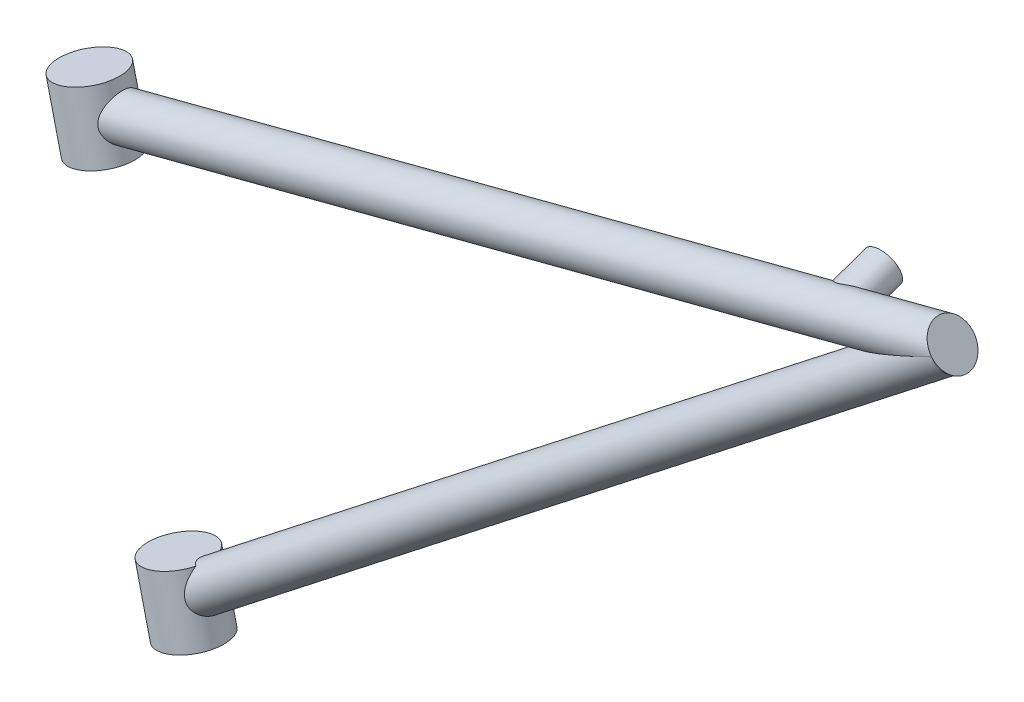
ISO-10303-21;
HEADER;
FILE_DESCRIPTION(('STEP AP214'),'2;1');
FILE_NAME('part.step','',(''),(''),'','','');
FILE_SCHEMA(('AUTOMOTIVE_DESIGN { 1 0 10303 214 1 1 1 1 }'));
ENDSEC;
DATA;
#1=APPLICATION_CONTEXT('core data for automotive mechanical design processes');
#2=APPLICATION_PROTOCOL_DEFINITION('international standard','automotive_design',2000,#1);
#3=PRODUCT_CONTEXT('',#1,'mechanical');
#4=PRODUCT('Part','Part','',(#3));
#5=PRODUCT_RELATED_PRODUCT_CATEGORY('part','',(#4));
#6=PRODUCT_DEFINITION_FORMATION('','',#4);
#7=PRODUCT_DEFINITION_CONTEXT('part definition',#1,'design');
#8=PRODUCT_DEFINITION('design','',#6,#7);
#9=PRODUCT_DEFINITION_SHAPE('','',#8);
#10=(LENGTH_UNIT() NAMED_UNIT(*) SI_UNIT(.MILLI.,.METRE.));
#11=(NAMED_UNIT(*) PLANE_ANGLE_UNIT() SI_UNIT($,.RADIAN.));
#12=(NAMED_UNIT(*) SI_UNIT($,.STERADIAN.) SOLID_ANGLE_UNIT());
#13=UNCERTAINTY_MEASURE_WITH_UNIT(LENGTH_MEASURE(1.E-05),#10,'distance_accuracy_value','');
#14=(GEOMETRIC_REPRESENTATION_CONTEXT(3) GLOBAL_UNCERTAINTY_ASSIGNED_CONTEXT((#13)) GLOBAL_UNIT_ASSIGNED_CONTEXT((#10,
#11,#12)) REPRESENTATION_CONTEXT('',''));
#15=CARTESIAN_POINT('',(0.,0.,0.));
#16=DIRECTION('',(0.,0.,1.));
#17=DIRECTION('',(1.,0.,0.));
#18=AXIS2_PLACEMENT_3D('',#15,#16,#17);
#19=CARTESIAN_POINT('',(215.,1151.6011,-53.649));
#20=DIRECTION('',(0.788508643665139,0.615015858971912,-0.00310033520835739));
#21=DIRECTION('',(-0.615018814783549,0.788512433295911,0.));
#22=AXIS2_PLACEMENT_3D('',#19,#20,#21);
#23=CYLINDRICAL_SURFACE('',#22,9.525);
#24=CARTESIAN_POINT('',(243.39562055654,1173.74893199642,-53.7606486710474));
#25=DIRECTION('',(-0.230684760062267,0.973028498209276,0.000288353283411398));
#26=DIRECTION('',(0.973022198051878,0.230684316193179,-0.00354236655039736));
#27=AXIS2_PLACEMENT_3D('',#24,#25,#26);
#28=ELLIPSE('',#27,22.8674930535986,9.525);
#29=CARTESIAN_POINT('',(224.320634321341,1169.225180437,-48.7995007985226));
#30=VERTEX_POINT('',#29);
#31=CARTESIAN_POINT('',(224.286262085042,1169.21993073521,-58.5827833271125));
#32=VERTEX_POINT('',#31);
#33=EDGE_CURVE('E105',#30,#32,#28,.F.);
#34=ORIENTED_EDGE('',*,*,#33,.F.);
#35=CARTESIAN_POINT('',(224.286262085042,1169.21993073521,-58.5827833271125));
#36=CARTESIAN_POINT('',(224.259857325888,1169.08518369756,-58.7334222265341));
#37=CARTESIAN_POINT('',(224.233039669883,1168.94604086328,-58.8799868131545));
#38=CARTESIAN_POINT('',(224.178991820654,1168.65996638962,-59.1650957687113));
#39=CARTESIAN_POINT('',(224.151761828018,1168.51303845566,-59.3036438886452));
#40=CARTESIAN_POINT('',(224.097330416037,1168.2125631291,-59.5727254876107));
#41=CARTESIAN_POINT('',(224.070129045662,1168.05902930883,-59.7032741781378));
#42=CARTESIAN_POINT('',(224.01607745269,1167.74582344913,-59.9568762347867));
#43=CARTESIAN_POINT('',(223.989227276873,1167.5861506029,-60.0799286101978));
#44=CARTESIAN_POINT('',(223.909708784618,1167.09862159596,-60.4383869338368));
#45=CARTESIAN_POINT('',(223.858116884653,1166.76249561412,-60.6628811966612));
#46=CARTESIAN_POINT('',(223.760795592024,1166.07242209011,-61.0842061784766));
#47=CARTESIAN_POINT('',(223.715069350101,1165.718465111,-61.2810220354276));
#48=CARTESIAN_POINT('',(223.636664786251,1165.0304754153,-61.6302543273577));
#49=CARTESIAN_POINT('',(223.603156724985,1164.69777584187,-61.7851169950369));
#50=CARTESIAN_POINT('',(223.546313161637,1164.02225456936,-62.0730099883752));
#51=CARTESIAN_POINT('',(223.522976398826,1163.67943413039,-62.2060430185345));
#52=CARTESIAN_POINT('',(223.489676812072,1162.9854248798,-62.4497650608225));
#53=CARTESIAN_POINT('',(223.479707198136,1162.63424040913,-62.5604653927971));
#54=CARTESIAN_POINT('',(223.476895189122,1161.92538048244,-62.7582826238399));
#55=CARTESIAN_POINT('',(223.484046705598,1161.56770737875,-62.8454078941737));
#56=CARTESIAN_POINT('',(223.526129800851,1160.72354013421,-63.019632003482));
#57=CARTESIAN_POINT('',(223.569782905443,1160.23511607562,-63.0963815878199));
#58=CARTESIAN_POINT('',(223.673039754559,1159.50421169317,-63.1703509628201));
#59=CARTESIAN_POINT('',(223.713721858204,1159.26100004498,-63.1881497714082));
#60=CARTESIAN_POINT('',(223.808925405596,1158.77656784518,-63.208784261346));
#61=CARTESIAN_POINT('',(223.863446913944,1158.53534730287,-63.21161987285));
#62=CARTESIAN_POINT('',(223.987999226804,1158.0538387664,-63.2009379730411));
#63=CARTESIAN_POINT('',(224.058226605981,1157.81360581606,-63.1872025274816));
#64=CARTESIAN_POINT('',(224.213948087072,1157.33984142985,-63.1417799374408));
#65=CARTESIAN_POINT('',(224.299441506856,1157.10630969509,-63.1100935949197));
#66=CARTESIAN_POINT('',(224.484918597031,1156.64861619958,-63.0279072957908));
#67=CARTESIAN_POINT('',(224.584894816063,1156.4244496964,-62.97741699291));
#68=CARTESIAN_POINT('',(224.797681142944,1155.98766669081,-62.8572366265394));
#69=CARTESIAN_POINT('',(224.910489960448,1155.77504903031,-62.7875484924329));
#70=CARTESIAN_POINT('',(225.128165273432,1155.39502394416,-62.6414190706142));
#71=CARTESIAN_POINT('',(225.231556877416,1155.22571379616,-62.5676942871559));
#72=CARTESIAN_POINT('',(225.44401194002,1154.8971588129,-62.406965429258));
#73=CARTESIAN_POINT('',(225.553077604184,1154.73791794574,-62.319956165241));
#74=CARTESIAN_POINT('',(225.775019094641,1154.42987011107,-62.1331560767408));
#75=CARTESIAN_POINT('',(225.887896113201,1154.28106645417,-62.0333612248764));
#76=CARTESIAN_POINT('',(226.115608918504,1153.99398465869,-61.8215969051118));
#77=CARTESIAN_POINT('',(226.230444940643,1153.85570779608,-61.7096259653097));
#78=CARTESIAN_POINT('',(226.46640898153,1153.58252515966,-61.4679271119184));
#79=CARTESIAN_POINT('',(226.587548762974,1153.44818382824,-61.337573472335));
#80=CARTESIAN_POINT('',(226.82820128942,1153.19075081337,-61.0648374828117));
#81=CARTESIAN_POINT('',(226.947714016948,1153.06765925064,-60.9224550038083));
#82=CARTESIAN_POINT('',(227.183456996661,1152.83235048838,-60.6263657424205));
#83=CARTESIAN_POINT('',(227.29968645648,1152.72013589822,-60.4726562581964));
#84=CARTESIAN_POINT('',(227.527315519424,1152.50626944914,-60.1546736029061));
#85=CARTESIAN_POINT('',(227.63871480492,1152.40461828425,-59.9903997388923));
#86=CARTESIAN_POINT('',(227.873123418797,1152.19569467397,-59.6241829279834));
#87=CARTESIAN_POINT('',(227.995029525822,1152.09024665705,-59.4204877809454));
#88=CARTESIAN_POINT('',(228.228473609432,1151.89287255824,-59.000949780285));
#89=CARTESIAN_POINT('',(228.340010636346,1151.80094771444,-58.7851058168927));
#90=CARTESIAN_POINT('',(228.551008201797,1151.63032006214,-58.3424633826018));
#91=CARTESIAN_POINT('',(228.650465034046,1151.55162130866,-58.1156615794439));
#92=CARTESIAN_POINT('',(228.83572510005,1151.40730238531,-57.6525195071222));
#93=CARTESIAN_POINT('',(228.92152837014,1151.34168218063,-57.416179263345));
#94=CARTESIAN_POINT('',(229.081485830094,1151.22090349209,-56.9251846859305));
#95=CARTESIAN_POINT('',(229.154989456591,1151.16630857725,-56.6701789396034));
#96=CARTESIAN_POINT('',(229.284460401839,1151.07117985988,-56.1531731303483));
#97=CARTESIAN_POINT('',(229.340427068882,1151.0306465799,-55.8911728078801));
#98=CARTESIAN_POINT('',(229.433846047649,1150.963646173,-55.3621714159013));
#99=CARTESIAN_POINT('',(229.471302148862,1150.93717616695,-55.0951713815594));
#100=CARTESIAN_POINT('',(229.527062363931,1150.89830263798,-54.5581687493097));
#101=CARTESIAN_POINT('',(229.545367263428,1150.88589853803,-54.2881662750304));
#102=CARTESIAN_POINT('',(229.562199853024,1150.87535932399,-53.7571259945295));
#103=CARTESIAN_POINT('',(229.561423639708,1150.87672092083,-53.4961198833487));
#104=CARTESIAN_POINT('',(229.54182225614,1150.89250809807,-52.9751874948947));
#105=CARTESIAN_POINT('',(229.522997505866,1150.9069333745,-52.7152611926364));
#106=CARTESIAN_POINT('',(229.467621648065,1150.94883442944,-52.198393218211));
#107=CARTESIAN_POINT('',(229.431072078148,1150.97630907593,-51.9414512891322));
#108=CARTESIAN_POINT('',(229.340854163361,1151.04429691626,-51.4323457186929));
#109=CARTESIAN_POINT('',(229.287185724139,1151.08481018195,-51.1801821036765));
#110=CARTESIAN_POINT('',(229.164114514175,1151.17849155133,-50.684408224491));
#111=CARTESIAN_POINT('',(229.094844818259,1151.23155280478,-50.4407446602848));
#112=CARTESIAN_POINT('',(228.941420982296,1151.35054264559,-49.9613837856289));
#113=CARTESIAN_POINT('',(228.857266934708,1151.41647115302,-49.7256864257047));
#114=CARTESIAN_POINT('',(228.675340927335,1151.56132618532,-49.2636028445119));
#115=CARTESIAN_POINT('',(228.577562843186,1151.64025855868,-49.0372208703685));
#116=CARTESIAN_POINT('',(228.369929673435,1151.81127984121,-48.5952204581985));
#117=CARTESIAN_POINT('',(228.260074308572,1151.90336905461,-48.379602269228));
#118=CARTESIAN_POINT('',(228.025641852722,1152.10472360081,-47.9524464985806));
#119=CARTESIAN_POINT('',(227.900664970458,1152.2145070493,-47.7413721247286));
#120=CARTESIAN_POINT('',(227.641692170489,1152.44898572412,-47.3334870610304));
#121=CARTESIAN_POINT('',(227.507695538429,1152.57368213214,-47.1366775035155));
#122=CARTESIAN_POINT('',(227.233168220124,1152.83848396559,-46.7586981138108));
#123=CARTESIAN_POINT('',(227.092639522964,1152.97858471773,-46.5775235679732));
#124=CARTESIAN_POINT('',(226.807776868606,1153.27482164288,-46.2320765009033));
#125=CARTESIAN_POINT('',(226.663443626362,1153.43095481881,-46.0678008320655));
#126=CARTESIAN_POINT('',(226.398381649131,1153.73220035553,-45.7835229472519));
#127=CARTESIAN_POINT('',(226.277756793015,1153.87476454738,-45.6607174563726));
#128=CARTESIAN_POINT('',(226.038026162807,1154.17157832639,-45.4284949783267));
#129=CARTESIAN_POINT('',(225.918920107725,1154.3258257143,-45.3190754814821));
#130=CARTESIAN_POINT('',(225.68447363856,1154.64583511665,-45.1144618249629));
#131=CARTESIAN_POINT('',(225.56912892202,1154.81158324434,-45.0192509321473));
#132=CARTESIAN_POINT('',(225.344231202539,1155.15444321128,-44.8435327087651));
#133=CARTESIAN_POINT('',(225.234678188904,1155.33155502955,-44.7630253510501));
#134=CARTESIAN_POINT('',(225.022918953883,1155.69734784393,-44.6167956848934));
#135=CARTESIAN_POINT('',(224.920752853279,1155.8860830084,-44.5511505102988));
#136=CARTESIAN_POINT('',(224.726236552822,1156.2731161268,-44.4353515205439));
#137=CARTESIAN_POINT('',(224.633885981681,1156.47141371862,-44.3851971192857));
#138=CARTESIAN_POINT('',(224.460378084522,1156.87601236501,-44.3002130778941));
#139=CARTESIAN_POINT('',(224.379220459273,1157.08231320545,-44.2653830280258));
#140=CARTESIAN_POINT('',(224.228871364813,1157.50114234092,-44.2105340427636));
#141=CARTESIAN_POINT('',(224.159681129355,1157.71367127539,-44.1905166337503));
#142=CARTESIAN_POINT('',(224.024758252432,1158.17268394055,-44.1627261198933));
#143=CARTESIAN_POINT('',(223.960810831434,1158.41981650712,-44.1570163817677));
#144=CARTESIAN_POINT('',(223.84806207577,1158.9173015926,-44.1623562048332));
#145=CARTESIAN_POINT('',(223.799263220286,1159.16765463159,-44.173408507524));
#146=CARTESIAN_POINT('',(223.715527415159,1159.6701047542,-44.2108590866441));
#147=CARTESIAN_POINT('',(223.680624287529,1159.92220459189,-44.2372944252073));
#148=CARTESIAN_POINT('',(223.623333552202,1160.42599160862,-44.3041988677007));
#149=CARTESIAN_POINT('',(223.600950420562,1160.67767860805,-44.3446729823029));
#150=CARTESIAN_POINT('',(223.558780297688,1161.30287687313,-44.4616078378177));
#151=CARTESIAN_POINT('',(223.545694317176,1161.67537289618,-44.5459758038928));
#152=CARTESIAN_POINT('',(223.538808081783,1162.41371197458,-44.7406100397313));
#153=CARTESIAN_POINT('',(223.545016437151,1162.77955198637,-44.8508878516685));
#154=CARTESIAN_POINT('',(223.572366659079,1163.50269049958,-45.0957872402616));
#155=CARTESIAN_POINT('',(223.593520155094,1163.85998212515,-45.230427713817));
#156=CARTESIAN_POINT('',(223.647104845075,1164.56390081036,-45.523302583792));
#157=CARTESIAN_POINT('',(223.679537190931,1164.9105267768,-45.6815393891229));
#158=CARTESIAN_POINT('',(223.756030086726,1165.62330036858,-46.0377397506442));
#159=CARTESIAN_POINT('',(223.800900330001,1165.98819350736,-46.238045206054));
#160=CARTESIAN_POINT('',(223.896881081983,1166.69941202241,-46.6677952406542));
#161=CARTESIAN_POINT('',(223.947988032294,1167.04574782584,-46.897223206772));
#162=CARTESIAN_POINT('',(224.026816912979,1167.5476009186,-47.2640278767862));
#163=CARTESIAN_POINT('',(224.053423020627,1167.7117661915,-47.3899166807251));
#164=CARTESIAN_POINT('',(224.106979674164,1168.03368651719,-47.6495584858503));
#165=CARTESIAN_POINT('',(224.133930170897,1168.19144247162,-47.7833103743365));
#166=CARTESIAN_POINT('',(224.187824471542,1168.5000637803,-48.0591988432474));
#167=CARTESIAN_POINT('',(224.214768147409,1168.65091427743,-48.2013521213038));
#168=CARTESIAN_POINT('',(224.268174197067,1168.94444836238,-48.494074583859));
#169=CARTESIAN_POINT('',(224.294636321789,1169.08712780152,-48.6446479681439));
#170=CARTESIAN_POINT('',(224.320634321341,1169.225180437,-48.7995007985225));
#171=B_SPLINE_CURVE_WITH_KNOTS('',3,(#35,#36,#37,#38,#39,#40,#41,#42,#43,#44,#45,#46,#47,#48,
#49,#50,#51,#52,#53,#54,#55,#56,#57,#58,#59,#60,#61,#62,#63,#64,#65,#66,#67,#68,#69,#70,#71,#72,
#73,#74,#75,#76,#77,#78,#79,#80,#81,#82,#83,#84,#85,#86,#87,#88,#89,#90,#91,#92,#93,#94,#95,#96,
#97,#98,#99,#100,#101,#102,#103,#104,#105,#106,#107,#108,#109,#110,#111,#112,#113,#114,#115,
#116,#117,#118,#119,#120,#121,#122,#123,#124,#125,#126,#127,#128,#129,#130,#131,#132,#133,#134,
#135,#136,#137,#138,#139,#140,#141,#142,#143,#144,#145,#146,#147,#148,#149,#150,#151,#152,#153,
#154,#155,#156,#157,#158,#159,#160,#161,#162,#163,#164,#165,#166,#167,#168,#169,#170),
.UNSPECIFIED.,.F.,.F.,(4,2,2,2,2,2,2,2,2,2,2,2,2,2,2,2,2,2,2,2,2,2,2,2,2,2,2,2,2,2,2,2,2,2,2,2,
2,2,2,2,2,2,2,2,2,2,2,2,2,2,2,2,2,2,2,2,2,2,2,2,2,2,2,2,2,2,2,4),(0.,0.611321113095535,
1.22235382943916,1.83218605530848,2.44209870234858,3.66289333627033,4.88434099855862,
5.98894252437597,7.09340709627896,8.19731043031264,9.30082126350922,10.7844934193151,
11.5255072719035,12.2665245834173,13.0173945439189,13.7682309617921,14.5186824394657,
15.2690585242179,15.9032452299519,16.5376803173909,17.172315741574,17.8070279688859,
18.4752867183988,19.1435526389087,19.8119784806391,20.48044821112,21.2588433186672,
22.0373096468024,22.8160142137429,23.5947167082835,24.4065344178049,25.2183822925518,
26.030063896594,26.8417122016533,27.6237962912566,28.4058621827752,29.1878602430734,
29.9698626134922,30.7454316380738,31.5209958450605,32.296909820138,33.0728417402577,
33.8781372588609,34.6834966314204,35.4886123495505,36.2935778332748,36.963445893815,
37.6331881707954,38.3021353757178,38.971081345498,39.6434233396011,40.3157398923394,
40.9880384679269,41.6604063114264,42.4252747618274,43.19026832305,43.9571126486434,
44.7242309558053,45.8689446439783,47.0141692429464,48.1602859732016,49.3065197888626,
50.561168015951,51.8151037127786,52.4406454213909,53.0660988220636,53.6928400783572,
54.3198967787742),.UNSPECIFIED.);
#172=EDGE_CURVE('E92',#32,#30,#171,.T.);
#173=ORIENTED_EDGE('',*,*,#172,.F.);
#174=EDGE_LOOP('',(#34,#173));
#175=FACE_BOUND('',#174,.T.);
#176=CARTESIAN_POINT('',(558.599999999999,1419.6,-55.));
#177=DIRECTION('',(0.897008226583714,0.442000857679935,-0.00338869463695132));
#178=DIRECTION('',(-0.441999884452041,0.897014466927656,0.00107157215105032));
#179=AXIS2_PLACEMENT_3D('',#176,#177,#178);
#180=ELLIPSE('',#179,9.72785711197768,9.525);
#181=CARTESIAN_POINT('',(558.633464600869,1419.60511105407,-45.4750601577955));
#182=VERTEX_POINT('',#181);
#183=CARTESIAN_POINT('',(558.566535399132,1419.59488894593,-64.5249398422045));
#184=VERTEX_POINT('',#183);
#185=EDGE_CURVE('E99',#182,#184,#180,.T.);
#186=ORIENTED_EDGE('',*,*,#185,.F.);
#187=CARTESIAN_POINT('',(558.599999999999,1419.6,-55.));
#188=DIRECTION('',(-0.441999884452041,0.897014466927656,0.00107157215105032));
#189=DIRECTION('',(0.897008226583714,0.442000857679935,-0.00338869463695132));
#190=AXIS2_PLACEMENT_3D('',#187,#188,#189);
#191=ELLIPSE('',#190,46.8855974220386,9.525);
#192=EDGE_CURVE('E127',#184,#182,#191,.T.);
#193=ORIENTED_EDGE('',*,*,#192,.F.);
#194=EDGE_LOOP('',(#186,#193));
#195=FACE_BOUND('',#194,.T.);
#196=ADVANCED_FACE('F73',(#175,#195),#23,.T.);
#197=CARTESIAN_POINT('',(175.,1320.3211,-53.599));
#198=DIRECTION('',(0.968096795715719,0.250551577091192,-0.00353572369863849));
#199=DIRECTION('',(-0.250553143221362,0.968102847027058,0.));
#200=AXIS2_PLACEMENT_3D('',#197,#198,#199);
#201=CYLINDRICAL_SURFACE('',#200,9.525);
#202=CARTESIAN_POINT('',(506.05821924033,1415.2241564026,-58.1347477989263));
#203=CARTESIAN_POINT('',(506.29100612402,1415.24854948241,-58.2289476427512));
#204=CARTESIAN_POINT('',(506.519486037677,1415.26519364984,-58.3358925342645));
#205=CARTESIAN_POINT('',(506.96780224134,1415.2829662225,-58.5679715084687));
#206=CARTESIAN_POINT('',(507.187624740682,1415.28407079788,-58.6931332296733));
#207=CARTESIAN_POINT('',(507.620363428624,1415.27061445303,-58.9567873327796));
#208=CARTESIAN_POINT('',(507.833230410184,1415.25595973741,-59.0953550137233));
#209=CARTESIAN_POINT('',(508.251246457574,1415.21059134699,-59.3809265472596));
#210=CARTESIAN_POINT('',(508.456399404336,1415.17988586642,-59.527926061177));
#211=CARTESIAN_POINT('',(508.857301320283,1415.10241109398,-59.8255885430173));
#212=CARTESIAN_POINT('',(509.053129563304,1415.05582446971,-59.9761924963363));
#213=CARTESIAN_POINT('',(509.437892203411,1414.94592861997,-60.2801448843021));
#214=CARTESIAN_POINT('',(509.626825757755,1414.88261735798,-60.4334936510572));
#215=CARTESIAN_POINT('',(509.996973858412,1414.73879108811,-60.7403000291856));
#216=CARTESIAN_POINT('',(510.178208765345,1414.65832535041,-60.893756100114));
#217=CARTESIAN_POINT('',(510.532880055768,1414.47935834895,-61.1991496601021));
#218=CARTESIAN_POINT('',(510.706317842987,1414.3808603479,-61.3510874186444));
#219=CARTESIAN_POINT('',(511.019925461091,1414.18075760825,-61.629638312308));
#220=CARTESIAN_POINT('',(511.161275081894,1414.08166967652,-61.7567317403534));
#221=CARTESIAN_POINT('',(511.436727967777,1413.86943053447,-62.0069580352422));
#222=CARTESIAN_POINT('',(511.570832512328,1413.75628181899,-62.1300915998279));
#223=CARTESIAN_POINT('',(511.830760924394,1413.51571953592,-62.3709455805561));
#224=CARTESIAN_POINT('',(511.956587948637,1413.38831145696,-62.4886680550604));
#225=CARTESIAN_POINT('',(512.198837442347,1413.11917316558,-62.7172354013745));
#226=CARTESIAN_POINT('',(512.31526140148,1412.97744522979,-62.8280813619391));
#227=CARTESIAN_POINT('',(512.5204908458,1412.70261050999,-63.025090082936));
#228=CARTESIAN_POINT('',(512.610802203518,1412.57147785245,-63.1124410674666));
#229=CARTESIAN_POINT('',(512.782912763076,1412.2995102294,-63.2801206732448));
#230=CARTESIAN_POINT('',(512.864713531721,1412.15867705772,-63.3604505866398));
#231=CARTESIAN_POINT('',(513.018969330202,1411.86795744664,-63.5131460664367));
#232=CARTESIAN_POINT('',(513.091428657434,1411.71807521707,-63.5855152927733));
#233=CARTESIAN_POINT('',(513.226296453716,1411.41002919717,-63.7214974888127));
#234=CARTESIAN_POINT('',(513.288704809466,1411.25186531351,-63.7851103598082));
#235=CARTESIAN_POINT('',(513.403008654854,1410.92780842767,-63.9030599914061));
#236=CARTESIAN_POINT('',(513.454870610002,1410.76189277185,-63.9573670787728));
#237=CARTESIAN_POINT('',(513.547350694073,1410.42405073316,-64.0559338789474));
#238=CARTESIAN_POINT('',(513.587968810541,1410.25212434363,-64.1001935806266));
#239=CARTESIAN_POINT('',(513.657672389247,1409.90363575371,-64.1783575124407));
#240=CARTESIAN_POINT('',(513.686757151597,1409.72707327267,-64.2122611140995));
#241=CARTESIAN_POINT('',(513.733305557345,1409.37075879124,-64.269629169197));
#242=CARTESIAN_POINT('',(513.750769321848,1409.1910068241,-64.2930937314219));
#243=CARTESIAN_POINT('',(513.773644639818,1408.83811736432,-64.3288769790759));
#244=CARTESIAN_POINT('',(513.77957789961,1408.66506003849,-64.3416623858691));
#245=CARTESIAN_POINT('',(513.78121951595,1408.31841022329,-64.3581659077366));
#246=CARTESIAN_POINT('',(513.776923956078,1408.14481755436,-64.3618805486853));
#247=CARTESIAN_POINT('',(513.758442044828,1407.79819204389,-64.3606523262742));
#248=CARTESIAN_POINT('',(513.744255099826,1407.62515923658,-64.3557089432839));
#249=CARTESIAN_POINT('',(513.706403211809,1407.28055045885,-64.3376837351077));
#250=CARTESIAN_POINT('',(513.682736432177,1407.10897477732,-64.3246003326083));
#251=CARTESIAN_POINT('',(513.616191857511,1406.7065175605,-64.2847849808038));
#252=CARTESIAN_POINT('',(513.569463326419,1406.47658160225,-64.2548312688044));
#253=CARTESIAN_POINT('',(513.460411453171,1406.0224225098,-64.1825081935261));
#254=CARTESIAN_POINT('',(513.398083198252,1405.79820119985,-64.1401349182788));
#255=CARTESIAN_POINT('',(513.258802713237,1405.35639314323,-64.0445643119436));
#256=CARTESIAN_POINT('',(513.181830485872,1405.13881594659,-63.9913521725987));
#257=CARTESIAN_POINT('',(513.014228279739,1404.71153553998,-63.8758235167526));
#258=CARTESIAN_POINT('',(512.923599390525,1404.50183170354,-63.8135077265698));
#259=CARTESIAN_POINT('',(512.727810623479,1404.087677094,-63.6804071254932));
#260=CARTESIAN_POINT('',(512.622441545151,1403.8833639571,-63.6095028156226));
#261=CARTESIAN_POINT('',(512.398746064062,1403.48413918409,-63.4618707759424));
#262=CARTESIAN_POINT('',(512.28041840666,1403.28922846095,-63.3851424824802));
#263=CARTESIAN_POINT('',(512.03096286268,1402.90943227785,-63.2278495341355));
#264=CARTESIAN_POINT('',(511.89983590386,1402.72454609275,-63.1472851575284));
#265=CARTESIAN_POINT('',(511.624585822468,1402.36548997933,-62.9845567491404));
#266=CARTESIAN_POINT('',(511.480465294677,1402.19131792304,-62.9023930393004));
#267=CARTESIAN_POINT('',(511.213076887011,1401.89302678543,-62.7577820390642));
#268=CARTESIAN_POINT('',(511.092551491082,1401.7665530116,-62.6951125525392));
#269=CARTESIAN_POINT('',(510.842980642155,1401.52113236613,-62.5719372393789));
#270=CARTESIAN_POINT('',(510.713934763951,1401.4021858707,-62.511431520957));
#271=CARTESIAN_POINT('',(510.446995295311,1401.17281680521,-62.3945078901478));
#272=CARTESIAN_POINT('',(510.30911364381,1401.06238315945,-62.3380846722754));
#273=CARTESIAN_POINT('',(510.024007160924,1400.85109915744,-62.2315048083531));
#274=CARTESIAN_POINT('',(509.87678579711,1400.75024527881,-62.181345856854));
#275=CARTESIAN_POINT('',(509.504092115459,1400.51669363493,-62.0693542251514));
#276=CARTESIAN_POINT('',(509.273156642678,1400.39002100816,-62.0123869079687));
#277=CARTESIAN_POINT('',(508.913130741659,1400.22216212885,-61.9474870370674));
#278=CARTESIAN_POINT('',(508.790932434085,1400.16992663773,-61.9292839111977));
#279=CARTESIAN_POINT('',(508.542548147951,1400.07350003414,-61.9005482917359));
#280=CARTESIAN_POINT('',(508.416364134289,1400.02930502827,-61.890012078193));
#281=CARTESIAN_POINT('',(508.160065227457,1399.94930338301,-61.8771287372367));
#282=CARTESIAN_POINT('',(508.029930406332,1399.9135520032,-61.8748342319548));
#283=CARTESIAN_POINT('',(507.767622208315,1399.85116062116,-61.8786881371339));
#284=CARTESIAN_POINT('',(507.635448847907,1399.82452054529,-61.8848364793597));
#285=CARTESIAN_POINT('',(507.370053228893,1399.78036581504,-61.9052120747608));
#286=CARTESIAN_POINT('',(507.236829890006,1399.76286229985,-61.9194491456813));
#287=CARTESIAN_POINT('',(506.970448069371,1399.73676051953,-61.9552374641569));
#288=CARTESIAN_POINT('',(506.837289666704,1399.72816728764,-61.9767928365734));
#289=CARTESIAN_POINT('',(506.53169088521,1399.71811123964,-62.0336834222884));
#290=CARTESIAN_POINT('',(506.35956274345,1399.71959475601,-62.0712147674192));
#291=CARTESIAN_POINT('',(506.017917076624,1399.73562976155,-62.154538635473));
#292=CARTESIAN_POINT('',(505.848401156953,1399.75018898451,-62.2003360346488));
#293=CARTESIAN_POINT('',(505.512116232922,1399.79116083288,-62.2980175708151));
#294=CARTESIAN_POINT('',(505.345356071114,1399.81760596606,-62.3499181104105));
#295=CARTESIAN_POINT('',(505.01528921563,1399.88124715505,-62.4577066613237));
#296=CARTESIAN_POINT('',(504.851981981826,1399.91844151583,-62.5135940429226));
#297=CARTESIAN_POINT('',(504.435786981334,1400.02693136158,-62.6605253183747));
#298=CARTESIAN_POINT('',(504.185401509635,1400.10553604854,-62.7533012102219));
#299=CARTESIAN_POINT('',(503.692867624157,1400.28479158305,-62.9395420120228));
#300=CARTESIAN_POINT('',(503.450723498134,1400.3854537099,-63.0330072507649));
#301=CARTESIAN_POINT('',(502.974501152562,1400.60747065086,-63.2168030691974));
#302=CARTESIAN_POINT('',(502.74043241173,1400.72884884994,-63.3071299659933));
#303=CARTESIAN_POINT('',(502.281136230675,1400.99131265079,-63.4812573755912));
#304=CARTESIAN_POINT('',(502.055907073502,1401.13239440095,-63.5650591589376));
#305=CARTESIAN_POINT('',(501.610501366563,1401.43692540988,-63.7249169169267));
#306=CARTESIAN_POINT('',(501.390531073589,1401.60078310381,-63.8007726321095));
#307=CARTESIAN_POINT('',(500.962189749687,1401.9480920231,-63.9397399107055));
#308=CARTESIAN_POINT('',(500.753820975575,1402.13154704056,-64.0028490007781));
#309=CARTESIAN_POINT('',(500.351495931838,1402.51683112117,-64.1132347021291));
#310=CARTESIAN_POINT('',(500.157496954478,1402.71860141509,-64.1605598245611));
#311=CARTESIAN_POINT('',(499.785986789589,1403.13996018264,-64.2367884190102));
#312=CARTESIAN_POINT('',(499.608464823913,1403.35953682987,-64.2657040068862));
#313=CARTESIAN_POINT('',(499.33162336232,1403.73534833599,-64.2960796780112));
#314=CARTESIAN_POINT('',(499.226628727945,1403.88695432641,-64.3035990158193));
#315=CARTESIAN_POINT('',(499.025923645827,1404.19633946778,-64.309087611393));
#316=CARTESIAN_POINT('',(498.930210590652,1404.35411686745,-64.3070595592413));
#317=CARTESIAN_POINT('',(498.749071099865,1404.67493864481,-64.2929265037126));
#318=CARTESIAN_POINT('',(498.663639287625,1404.8379802125,-64.2808267938003));
#319=CARTESIAN_POINT('',(498.503930263826,1405.16838506385,-64.246183726476));
#320=CARTESIAN_POINT('',(498.429653461683,1405.33574850585,-64.2236399858673));
#321=CARTESIAN_POINT('',(498.292793198896,1405.67432382277,-64.1678115112144));
#322=CARTESIAN_POINT('',(498.230262369248,1405.84554934097,-64.1344801733285));
#323=CARTESIAN_POINT('',(498.117978257667,1406.18977993188,-64.0571622577553));
#324=CARTESIAN_POINT('',(498.068224918964,1406.36278499668,-64.0131757274111));
#325=CARTESIAN_POINT('',(497.981956405477,1406.70915534591,-63.9148496616778));
#326=CARTESIAN_POINT('',(497.945441473185,1406.88252063687,-63.8605099366739));
#327=CARTESIAN_POINT('',(497.885865515295,1407.228194925,-63.7420140039228));
#328=CARTESIAN_POINT('',(497.862804064731,1407.40050395536,-63.6778581063269));
#329=CARTESIAN_POINT('',(497.831152052918,1407.73167367148,-63.5449095197683));
#330=CARTESIAN_POINT('',(497.821722475219,1407.89068371237,-63.4766845910438));
#331=CARTESIAN_POINT('',(497.814382113173,1408.20571809548,-63.3329828777896));
#332=CARTESIAN_POINT('',(497.816475274904,1408.3617413965,-63.2575036176364));
#333=CARTESIAN_POINT('',(497.831836644049,1408.66988185113,-63.1001220188545));
#334=CARTESIAN_POINT('',(497.845101363045,1408.82200020881,-63.0182216925003));
#335=CARTESIAN_POINT('',(497.882338114599,1409.12175021316,-62.8487915230353));
#336=CARTESIAN_POINT('',(497.906314133869,1409.26938016738,-62.7612595942531));
#337=CARTESIAN_POINT('',(497.998338205668,1409.72856573339,-62.4766705351407));
#338=CARTESIAN_POINT('',(498.085207946373,1410.03101256004,-62.2706676892807));
#339=CARTESIAN_POINT('',(498.301178162913,1410.60932029928,-61.844178982682));
#340=CARTESIAN_POINT('',(498.430314257635,1410.88515853344,-61.6236810322493));
#341=CARTESIAN_POINT('',(498.687673047463,1411.34196958787,-61.2333225551336));
#342=CARTESIAN_POINT('',(498.807572090024,1411.52908309839,-61.0650397569665));
#343=CARTESIAN_POINT('',(499.066359255502,1411.88865638925,-60.7272277749527));
#344=CARTESIAN_POINT('',(499.205256061221,1412.06110941033,-60.5576980549273));
#345=CARTESIAN_POINT('',(499.501112233722,1412.39205775683,-60.2200161794854));
#346=CARTESIAN_POINT('',(499.658103707178,1412.55052736306,-60.0518670579532));
#347=CARTESIAN_POINT('',(499.989299730259,1412.85381911988,-59.7204031396036));
#348=CARTESIAN_POINT('',(500.163498350197,1412.99864593848,-59.5570867024522));
#349=CARTESIAN_POINT('',(500.483210939852,1413.24073452755,-59.2789476775073));
#350=CARTESIAN_POINT('',(500.624960942283,1413.34081553951,-59.1622360378301));
#351=CARTESIAN_POINT('',(500.918310525719,1413.53412368552,-58.9356274691287));
#352=CARTESIAN_POINT('',(501.069910965251,1413.62735022065,-58.8257311357368));
#353=CARTESIAN_POINT('',(501.382868461447,1413.80701071354,-58.6155690351684));
#354=CARTESIAN_POINT('',(501.544200468906,1413.89346089556,-58.5152801289374));
#355=CARTESIAN_POINT('',(501.877081208651,1414.05994916483,-58.3273413581147));
#356=CARTESIAN_POINT('',(502.048624509273,1414.13999060886,-58.2396848574109));
#357=CARTESIAN_POINT('',(502.456565606131,1414.31741968928,-58.0566132126297));
#358=CARTESIAN_POINT('',(502.696714226664,1414.41259528743,-57.9670682760906));
#359=CARTESIAN_POINT('',(503.068145486512,1414.54641449917,-57.8621480617204));
#360=CARTESIAN_POINT('',(503.193760792277,1414.58951160577,-57.8320816009595));
#361=CARTESIAN_POINT('',(503.448117931727,1414.67253274633,-57.7828953802259));
#362=CARTESIAN_POINT('',(503.576858125827,1414.71245839926,-57.7637700037244));
#363=CARTESIAN_POINT('',(503.837702127859,1414.78919327573,-57.7372357587614));
#364=CARTESIAN_POINT('',(503.969825477583,1414.82597228716,-57.729930515521));
#365=CARTESIAN_POINT('',(504.235191949615,1414.89570078864,-57.7277457731098));
#366=CARTESIAN_POINT('',(504.368435134808,1414.92865006205,-57.7328669764864));
#367=CARTESIAN_POINT('',(504.634899446761,1414.99043496409,-57.7553014554274));
#368=CARTESIAN_POINT('',(504.768120535721,1415.01926870907,-57.7726202923914));
#369=CARTESIAN_POINT('',(505.033412408408,1415.07257503563,-57.8186401565875));
#370=CARTESIAN_POINT('',(505.165483402824,1415.09704843271,-57.8473390522467));
#371=CARTESIAN_POINT('',(505.425742635804,1415.14116292649,-57.9144134975578));
#372=CARTESIAN_POINT('',(505.553959381214,1415.16087173649,-57.9526355464832));
#373=CARTESIAN_POINT('',(505.807932749072,1415.19584130252,-58.0376124127191));
#374=CARTESIAN_POINT('',(505.933692237577,1415.21110756983,-58.0843565396536));
#375=CARTESIAN_POINT('',(506.05821924033,1415.2241564026,-58.1347477989263));
#376=B_SPLINE_CURVE_WITH_KNOTS('',3,(#202,#203,#204,#205,#206,#207,#208,#209,#210,#211,#212,
#213,#214,#215,#216,#217,#218,#219,#220,#221,#222,#223,#224,#225,#226,#227,#228,#229,#230,#231,
#232,#233,#234,#235,#236,#237,#238,#239,#240,#241,#242,#243,#244,#245,#246,#247,#248,#249,#250,
#251,#252,#253,#254,#255,#256,#257,#258,#259,#260,#261,#262,#263,#264,#265,#266,#267,#268,#269,
#270,#271,#272,#273,#274,#275,#276,#277,#278,#279,#280,#281,#282,#283,#284,#285,#286,#287,#288,
#289,#290,#291,#292,#293,#294,#295,#296,#297,#298,#299,#300,#301,#302,#303,#304,#305,#306,#307,
#308,#309,#310,#311,#312,#313,#314,#315,#316,#317,#318,#319,#320,#321,#322,#323,#324,#325,#326,
#327,#328,#329,#330,#331,#332,#333,#334,#335,#336,#337,#338,#339,#340,#341,#342,#343,#344,#345,
#346,#347,#348,#349,#350,#351,#352,#353,#354,#355,#356,#357,#358,#359,#360,#361,#362,#363,#364,
#365,#366,#367,#368,#369,#370,#371,#372,#373,#374,#375),.UNSPECIFIED.,.T.,.F.,(4,2,2,2,2,2,2,2,
2,2,2,2,2,2,2,2,2,2,2,2,2,2,2,2,2,2,2,2,2,2,2,2,2,2,2,2,2,2,2,2,2,2,2,2,2,2,2,2,2,2,2,2,2,2,2,2,
2,2,2,2,2,2,2,2,2,2,2,2,2,2,2,2,2,2,2,2,2,2,2,2,2,2,2,2,2,2,4),(0.,0.756711994774756,
1.51458427533639,2.27699231637517,3.0390115127593,3.79254608293273,4.54617245160729,
5.29766277342185,6.04901725698702,6.69153429421196,7.33393749028866,7.97609426086196,
8.61814909823063,9.16242442313339,9.70659936857028,10.2505230739896,10.7944529103738,
11.3400861355372,11.8857199650397,12.4313869006064,12.9770481495961,13.4973864000644,
14.0179239101262,14.5384926624711,15.0591623182408,15.7677540060573,16.4765691294825,
17.1863592240257,17.8960927201453,18.617176196642,19.3383295497303,20.0594306687159,
20.780388103403,21.3368881124495,21.893415914091,22.4492069728423,23.0047928762291,
23.8097497919244,24.2117251329578,24.6135053071116,25.0178462751957,25.4221839754049,
25.8270134947098,26.232071570541,26.759759810403,27.2877603639135,27.8172138617594,
28.3465839171883,29.1804368354944,30.0147171521717,30.8499455366628,31.6850108799576,
32.5376600820488,33.3904745726075,34.2406432976063,35.0902519214698,35.6434369413901,
36.1964661046404,36.7492047900571,37.3019637573435,37.8571433254655,38.4123204268552,
38.9675076970745,39.5226774292412,40.0419621251789,40.561424666493,41.0807250611189,
41.6002188989131,42.7241000168903,43.8489307060853,44.6841805606057,45.5198134442386,
46.3569525649457,47.1938042022399,47.8207610039146,48.4477725222675,49.0732338026577,
49.698365305748,50.5152841999681,50.9233509170801,51.3312079675973,51.7426216334036,
52.154058559628,52.5656831983056,52.9772307729052,53.3825312128179,53.7873266856666),.UNSPECIFIED.);
#377=CARTESIAN_POINT('',(506.05821924033,1415.2241564026,-58.1347477989263));
#378=VERTEX_POINT('',#377);
#379=EDGE_CURVE('E12',#378,#378,#376,.T.);
#380=ORIENTED_EDGE('',*,*,#379,.F.);
#381=EDGE_LOOP('',(#380));
#382=FACE_BOUND('',#381,.T.);
#383=CARTESIAN_POINT('',(186.358449875382,1333.09959285992,-53.6491999503622));
#384=CARTESIAN_POINT('',(186.357581805738,1333.09936924817,-53.8860568586097));
#385=CARTESIAN_POINT('',(186.352921387654,1333.08902414914,-54.1228779562829));
#386=CARTESIAN_POINT('',(186.336141928165,1333.04828094335,-54.5945068523737));
#387=CARTESIAN_POINT('',(186.324023352325,1333.01788408828,-54.8293147755331));
#388=CARTESIAN_POINT('',(186.292666114835,1332.93755309473,-55.2951172089378));
#389=CARTESIAN_POINT('',(186.273425955695,1332.88761484706,-55.526110906468));
#390=CARTESIAN_POINT('',(186.228361236772,1332.76901114286,-55.9825714129173));
#391=CARTESIAN_POINT('',(186.202536484875,1332.70034513992,-56.2080380603657));
#392=CARTESIAN_POINT('',(186.145145325905,1332.54570964981,-56.6508525754505));
#393=CARTESIAN_POINT('',(186.113609333163,1332.45983157607,-56.8682364289368));
#394=CARTESIAN_POINT('',(186.045493710991,1332.27164581024,-57.2950339080024));
#395=CARTESIAN_POINT('',(186.00891210623,1332.16933168093,-57.5044443708686));
#396=CARTESIAN_POINT('',(185.931611677371,1331.94951339829,-57.9142212421292));
#397=CARTESIAN_POINT('',(185.890894265745,1331.83201442722,-58.1145907046935));
#398=CARTESIAN_POINT('',(185.806239384516,1331.58291939138,-58.5057339536995));
#399=CARTESIAN_POINT('',(185.762300721704,1331.45131809444,-58.6965041398218));
#400=CARTESIAN_POINT('',(185.668207883311,1331.16291156617,-59.0843166682633));
#401=CARTESIAN_POINT('',(185.617847978309,1331.00490627344,-59.2804163396614));
#402=CARTESIAN_POINT('',(185.515822385934,1330.67483630273,-59.6600487913169));
#403=CARTESIAN_POINT('',(185.464156548356,1330.50277000237,-59.8435801169037));
#404=CARTESIAN_POINT('',(185.360844773911,1330.14549946665,-60.197931970596));
#405=CARTESIAN_POINT('',(185.309198975563,1329.96027646621,-60.3687336016283));
#406=CARTESIAN_POINT('',(185.207513427391,1329.57802118981,-60.6969344393526));
#407=CARTESIAN_POINT('',(185.157473194482,1329.38099251812,-60.8543377013953));
#408=CARTESIAN_POINT('',(185.052074145416,1328.94040065302,-61.1819144564466));
#409=CARTESIAN_POINT('',(184.997324603338,1328.69474183357,-61.3494760918669));
#410=CARTESIAN_POINT('',(184.895124717704,1328.18960759521,-61.6650101261469));
#411=CARTESIAN_POINT('',(184.847676144492,1327.93012884571,-61.8129777726354));
#412=CARTESIAN_POINT('',(184.763424911842,1327.39915978738,-62.0881314357339));
#413=CARTESIAN_POINT('',(184.726607184471,1327.12768711447,-62.2153467537986));
#414=CARTESIAN_POINT('',(184.667181423721,1326.57392268385,-62.4479771640655));
#415=CARTESIAN_POINT('',(184.64457385024,1326.29163057629,-62.5533915506263));
#416=CARTESIAN_POINT('',(184.621485123181,1325.80286250974,-62.7131545304106));
#417=CARTESIAN_POINT('',(184.616451088553,1325.59851542322,-62.7734026114947));
#418=CARTESIAN_POINT('',(184.616781271352,1325.18667623677,-62.88151769934));
#419=CARTESIAN_POINT('',(184.622138831213,1324.9791862349,-62.9293926109313));
#420=CARTESIAN_POINT('',(184.644451588589,1324.56250380516,-63.0120817315778));
#421=CARTESIAN_POINT('',(184.661391083203,1324.35331406078,-63.0469135257822));
#422=CARTESIAN_POINT('',(184.707787702243,1323.93447859591,-63.1030109629274));
#423=CARTESIAN_POINT('',(184.737244818194,1323.72483287572,-63.1242766150539));
#424=CARTESIAN_POINT('',(184.809376765781,1323.30562257425,-63.1528835624823));
#425=CARTESIAN_POINT('',(184.852125615775,1323.09606519691,-63.1601452000057));
#426=CARTESIAN_POINT('',(184.950720167319,1322.68004735338,-63.1603045370767));
#427=CARTESIAN_POINT('',(185.006565827107,1322.47358687733,-63.153202282425));
#428=CARTESIAN_POINT('',(185.130725059478,1322.06534813991,-63.124715285959));
#429=CARTESIAN_POINT('',(185.1990452174,1321.86357241537,-63.1033229844382));
#430=CARTESIAN_POINT('',(185.346956732024,1321.46622562205,-63.0466041357607));
#431=CARTESIAN_POINT('',(185.426548259071,1321.27065464711,-63.0112773779979));
#432=CARTESIAN_POINT('',(185.589795585038,1320.89964521409,-62.9300597690826));
#433=CARTESIAN_POINT('',(185.672819955293,1320.72373655515,-62.8850372001994));
#434=CARTESIAN_POINT('',(185.845969463324,1320.37871903053,-62.7838642623975));
#435=CARTESIAN_POINT('',(185.93609722828,1320.20961271594,-62.7277097646059));
#436=CARTESIAN_POINT('',(186.215068504544,1319.71289126492,-62.54329813677));
#437=CARTESIAN_POINT('',(186.412512692632,1319.39584564143,-62.3990866125953));
#438=CARTESIAN_POINT('',(186.765826290244,1318.87052979932,-62.1152121318951));
#439=CARTESIAN_POINT('',(186.919011236763,1318.65554568582,-61.9842838873622));
#440=CARTESIAN_POINT('',(187.228263744508,1318.24098753079,-61.7026174616929));
#441=CARTESIAN_POINT('',(187.384332336723,1318.04141913833,-61.5518720727678));
#442=CARTESIAN_POINT('',(187.696163578207,1317.65729232131,-61.2313067808288));
#443=CARTESIAN_POINT('',(187.851925349499,1317.47275820803,-61.061457000686));
#444=CARTESIAN_POINT('',(188.15984241871,1317.1189504319,-60.7036160437416));
#445=CARTESIAN_POINT('',(188.311998122509,1316.94967504553,-60.5156269208007));
#446=CARTESIAN_POINT('',(188.611258175865,1316.62499302276,-60.1202846008485));
#447=CARTESIAN_POINT('',(188.758302080137,1316.46973067059,-59.9127669583086));
#448=CARTESIAN_POINT('',(189.043006391365,1316.17528054179,-59.4805307218162));
#449=CARTESIAN_POINT('',(189.180666052356,1316.03609404243,-59.2558107634381));
#450=CARTESIAN_POINT('',(189.443583326935,1315.77472067425,-58.7903989265441));
#451=CARTESIAN_POINT('',(189.56886071874,1315.65250656462,-58.5497335795888));
#452=CARTESIAN_POINT('',(189.804496573069,1315.42576218832,-58.0532590524574));
#453=CARTESIAN_POINT('',(189.914858982971,1315.32122724086,-57.7974539050311));
#454=CARTESIAN_POINT('',(190.097360437763,1315.1502664167,-57.3256531481095));
#455=CARTESIAN_POINT('',(190.172709407114,1315.08041316403,-57.1121321695133));
#456=CARTESIAN_POINT('',(190.310988394956,1314.9531980356,-56.6774962166102));
#457=CARTESIAN_POINT('',(190.373920711047,1314.89583384865,-56.4563826561554));
#458=CARTESIAN_POINT('',(190.486204383596,1314.79417399333,-56.0078915180193));
#459=CARTESIAN_POINT('',(190.535561910641,1314.74987238654,-55.7805168382876));
#460=CARTESIAN_POINT('',(190.619775648931,1314.67479620972,-55.3208802448295));
#461=CARTESIAN_POINT('',(190.654631569934,1314.64402191043,-55.088618233383));
#462=CARTESIAN_POINT('',(190.709219506578,1314.59629971111,-54.620094518065));
#463=CARTESIAN_POINT('',(190.728899436158,1314.57939941584,-54.3838218589998));
#464=CARTESIAN_POINT('',(190.752522070303,1314.55982499237,-53.9098999993929));
#465=CARTESIAN_POINT('',(190.756464777017,1314.55715086223,-53.6722507990392));
#466=CARTESIAN_POINT('',(190.74853796159,1314.56606538467,-53.1974797402003));
#467=CARTESIAN_POINT('',(190.736667952536,1314.57765447645,-52.9603578981791));
#468=CARTESIAN_POINT('',(190.697385799487,1314.61494272464,-52.4885342998953));
#469=CARTESIAN_POINT('',(190.669974064182,1314.64064151002,-52.2538324801602));
#470=CARTESIAN_POINT('',(190.60210702458,1314.70404480997,-51.8012890673313));
#471=CARTESIAN_POINT('',(190.562442949291,1314.74101966432,-51.5832251363854));
#472=CARTESIAN_POINT('',(190.470468361588,1314.82691729862,-51.1521053557148));
#473=CARTESIAN_POINT('',(190.418153471505,1314.87584421449,-50.9390512676522));
#474=CARTESIAN_POINT('',(190.301804769865,1314.98516246825,-50.5192623113846));
#475=CARTESIAN_POINT('',(190.23777433869,1315.04555049935,-50.3125256403926));
#476=CARTESIAN_POINT('',(190.098988703125,1315.17732773214,-49.9062127733766));
#477=CARTESIAN_POINT('',(190.024229563262,1315.24872097144,-49.7066392386435));
#478=CARTESIAN_POINT('',(189.859092695624,1315.40779858859,-49.3007311374482));
#479=CARTESIAN_POINT('',(189.767961451142,1315.49630657265,-49.0950262173476));
#480=CARTESIAN_POINT('',(189.575995491525,1315.68492732757,-48.6936144814056));
#481=CARTESIAN_POINT('',(189.475156675702,1315.78504500631,-48.4979119446988));
#482=CARTESIAN_POINT('',(189.26523354595,1315.99640745987,-48.1171153382557));
#483=CARTESIAN_POINT('',(189.156145774544,1316.10765690685,-47.9320257746452));
#484=CARTESIAN_POINT('',(188.931243948177,1316.34086214408,-47.5730060039958));
#485=CARTESIAN_POINT('',(188.815429173267,1316.462819081,-47.3990769956121));
#486=CARTESIAN_POINT('',(188.559595552326,1316.73754646288,-47.0358277650413));
#487=CARTESIAN_POINT('',(188.418671770066,1316.89212314421,-46.8485064696081));
#488=CARTESIAN_POINT('',(188.13219334881,1317.21509488208,-46.4899780943311));
#489=CARTESIAN_POINT('',(187.98663799616,1317.38349207451,-46.3187735140675));
#490=CARTESIAN_POINT('',(187.69335940703,1317.73417382321,-45.993015875013));
#491=CARTESIAN_POINT('',(187.545635360469,1317.9164636812,-45.8384692281109));
#492=CARTESIAN_POINT('',(187.250896297353,1318.29489878848,-45.546893630638));
#493=CARTESIAN_POINT('',(187.10388116203,1318.49104162417,-45.4098616401601));
#494=CARTESIAN_POINT('',(186.711848019207,1319.03983337127,-45.0646876401787));
#495=CARTESIAN_POINT('',(186.470069582025,1319.40614092922,-44.8736949049768));
#496=CARTESIAN_POINT('',(186.128594725721,1319.98579136724,-44.6318338491623));
#497=CARTESIAN_POINT('',(186.0183486621,1320.18393967721,-44.5586753759218));
#498=CARTESIAN_POINT('',(185.807142470588,1320.59017598142,-44.428001535468));
#499=CARTESIAN_POINT('',(185.706180581936,1320.79826207953,-44.3704831980091));
#500=CARTESIAN_POINT('',(185.530685811562,1321.19053640945,-44.2796599099045));
#501=CARTESIAN_POINT('',(185.454481769683,1321.37343182466,-44.2439841214191));
#502=CARTESIAN_POINT('',(185.311718069508,1321.74487735506,-44.1849503604514));
#503=CARTESIAN_POINT('',(185.245156582567,1321.93342638987,-44.1615900502011));
#504=CARTESIAN_POINT('',(185.12276253222,1322.31497282549,-44.1275367958688));
#505=CARTESIAN_POINT('',(185.066923258771,1322.507967359,-44.11683590764));
#506=CARTESIAN_POINT('',(184.966599723133,1322.89717359928,-44.1082177379753));
#507=CARTESIAN_POINT('',(184.92211571741,1323.09338537861,-44.1103007452468));
#508=CARTESIAN_POINT('',(184.844776252853,1323.48730711267,-44.1271574854349));
#509=CARTESIAN_POINT('',(184.811907648939,1323.68501511354,-44.1419168073075));
#510=CARTESIAN_POINT('',(184.757495126135,1324.08065900116,-44.1838093238672));
#511=CARTESIAN_POINT('',(184.735951123118,1324.27859488622,-44.2109424266309));
#512=CARTESIAN_POINT('',(184.70354236532,1324.67351258009,-44.2771572319573));
#513=CARTESIAN_POINT('',(184.692687677242,1324.87049331603,-44.3162501524127));
#514=CARTESIAN_POINT('',(184.68076744278,1325.26222490871,-44.4058469426852));
#515=CARTESIAN_POINT('',(184.679707454993,1325.45697443661,-44.4563572753527));
#516=CARTESIAN_POINT('',(184.687432459972,1325.90937755942,-44.5873846734801));
#517=CARTESIAN_POINT('',(184.699715432589,1326.16571891247,-44.6722531138744));
#518=CARTESIAN_POINT('',(184.737184333095,1326.67067267163,-44.8602330441933));
#519=CARTESIAN_POINT('',(184.762375216181,1326.91928207063,-44.9633515301394));
#520=CARTESIAN_POINT('',(184.822955696175,1327.40770496011,-45.1868747568261));
#521=CARTESIAN_POINT('',(184.858359441897,1327.64750572402,-45.3073033619292));
#522=CARTESIAN_POINT('',(184.936812023289,1328.11684032839,-45.564459999739));
#523=CARTESIAN_POINT('',(184.979860231173,1328.34637501001,-45.701186693695));
#524=CARTESIAN_POINT('',(185.072300087104,1328.79902176096,-45.9933844218682));
#525=CARTESIAN_POINT('',(185.121807668162,1329.02189163759,-46.1491936767173));
#526=CARTESIAN_POINT('',(185.22424037892,1329.45488860031,-46.4766106031539));
#527=CARTESIAN_POINT('',(185.277165647241,1329.66501516887,-46.6482189156703));
#528=CARTESIAN_POINT('',(185.384406200937,1330.07117091901,-47.0066185949464));
#529=CARTESIAN_POINT('',(185.438720168277,1330.26721284094,-47.1933959061554));
#530=CARTESIAN_POINT('',(185.546984847139,1330.64416011972,-47.5819021627384));
#531=CARTESIAN_POINT('',(185.600935430507,1330.82506036979,-47.7836361095697));
#532=CARTESIAN_POINT('',(185.703609981598,1331.15991960414,-48.1890961845373));
#533=CARTESIAN_POINT('',(185.752454295458,1331.31483948368,-48.391997545968));
#534=CARTESIAN_POINT('',(185.84691275443,1331.60840694889,-48.8098351485464));
#535=CARTESIAN_POINT('',(185.8925285236,1331.74706273932,-49.0247652400169));
#536=CARTESIAN_POINT('',(185.979264145823,1332.00667430089,-49.4659537140339));
#537=CARTESIAN_POINT('',(186.020384057609,1332.12763030326,-49.6922119485354));
#538=CARTESIAN_POINT('',(186.096912393674,1332.35026974381,-50.1549758014051));
#539=CARTESIAN_POINT('',(186.132320921415,1332.45195353111,-50.3914812340472));
#540=CARTESIAN_POINT('',(186.19609848046,1332.63387559637,-50.8716561480927));
#541=CARTESIAN_POINT('',(186.22451430816,1332.71425673083,-51.1152650812674));
#542=CARTESIAN_POINT('',(186.273687588887,1332.85311224309,-51.6094271370383));
#543=CARTESIAN_POINT('',(186.294445112961,1332.91158682411,-51.8599801951905));
#544=CARTESIAN_POINT('',(186.327567958921,1333.00548903654,-52.3657615985444));
#545=CARTESIAN_POINT('',(186.339938743977,1333.04093167046,-52.620986788781));
#546=CARTESIAN_POINT('',(186.355851439896,1333.08810419856,-53.1338888977806));
#547=CARTESIAN_POINT('',(186.359394093362,1333.09983608721,-53.3915656084966));
#548=CARTESIAN_POINT('',(186.358449875382,1333.09959285992,-53.6491999503622));
#549=B_SPLINE_CURVE_WITH_KNOTS('',3,(#383,#384,#385,#386,#387,#388,#389,#390,#391,#392,#393,
#394,#395,#396,#397,#398,#399,#400,#401,#402,#403,#404,#405,#406,#407,#408,#409,#410,#411,#412,
#413,#414,#415,#416,#417,#418,#419,#420,#421,#422,#423,#424,#425,#426,#427,#428,#429,#430,#431,
#432,#433,#434,#435,#436,#437,#438,#439,#440,#441,#442,#443,#444,#445,#446,#447,#448,#449,#450,
#451,#452,#453,#454,#455,#456,#457,#458,#459,#460,#461,#462,#463,#464,#465,#466,#467,#468,#469,
#470,#471,#472,#473,#474,#475,#476,#477,#478,#479,#480,#481,#482,#483,#484,#485,#486,#487,#488,
#489,#490,#491,#492,#493,#494,#495,#496,#497,#498,#499,#500,#501,#502,#503,#504,#505,#506,#507,
#508,#509,#510,#511,#512,#513,#514,#515,#516,#517,#518,#519,#520,#521,#522,#523,#524,#525,#526,
#527,#528,#529,#530,#531,#532,#533,#534,#535,#536,#537,#538,#539,#540,#541,#542,#543,#544,#545,
#546,#547,#548),.UNSPECIFIED.,.T.,.F.,(4,2,2,2,2,2,2,2,2,2,2,2,2,2,2,2,2,2,2,2,2,2,2,2,2,2,2,2,
2,2,2,2,2,2,2,2,2,2,2,2,2,2,2,2,2,2,2,2,2,2,2,2,2,2,2,2,2,2,2,2,2,2,2,2,2,2,2,2,2,2,2,2,2,2,2,2,
2,2,2,2,2,2,4),(0.,0.710310532065492,1.42057672855423,2.13099236113728,2.84142872358443,
3.5481874354624,4.25522362907283,4.96201916039265,5.66907783724382,6.43880362490134,
7.20861835119722,7.97955399035221,8.75025545066418,9.65630521078588,10.5625743253641,
11.467552536204,12.3725600343403,13.0113085736469,13.6496480221224,14.2871237154373,
14.924598977121,15.5656897589392,16.2067784965753,16.8482066512131,17.489644500793,
18.0880261108857,18.6866300795514,19.8837448008437,20.766757648491,21.6500925541691,
22.5348286253754,23.4194646379888,24.3123622815724,25.2053308201038,26.0968491514646,
26.9881310708987,27.6982812613551,28.4082999208326,29.1179952971405,29.827704877021,
30.5398395669877,31.2519741597256,31.964130681342,32.6762684766829,33.3496420855111,
34.0232490418869,34.6966619425942,35.3703224970922,36.0949159830459,36.8198169073012,
37.5450233697629,38.2703075902344,39.1117981320394,39.9534189683606,40.7953626089414,
41.6371599197263,43.066682546431,43.7807742086203,44.4947301615389,45.09806308502,
45.7012814404205,46.3041210580419,46.9069742900515,47.509143075325,48.1113073872364,
48.7140382490255,49.3171111460853,50.12683525087,50.9368704324654,51.748033264266,
52.5591295117293,53.3875647966806,54.2160337040368,55.0437435262465,55.8717313916595,
56.6507079843022,57.429289900706,58.2078616446578,58.9864192832424,59.7596156087014,
60.5328047610201,61.3054897682176,62.0781097766562),.UNSPECIFIED.);
#550=CARTESIAN_POINT('',(186.358449875382,1333.09959285992,-53.6491999503622));
#551=VERTEX_POINT('',#550);
#552=EDGE_CURVE('E86',#551,#551,#549,.T.);
#553=ORIENTED_EDGE('',*,*,#552,.F.);
#554=EDGE_LOOP('',(#553));
#555=FACE_BOUND('',#554,.T.);
#556=CARTESIAN_POINT('',(558.600000000001,1419.6,-55.));
#557=DIRECTION('',(0.788508643665139,0.615015858971912,-0.00310033520835738));
#558=DIRECTION('',(0.615013638287672,-0.788514556162628,-0.00173765353659148));
#559=AXIS2_PLACEMENT_3D('',#556,#557,#558);
#560=ELLIPSE('',#559,10.38195969076,9.525);
#561=EDGE_CURVE('E120',#182,#184,#560,.F.);
#562=ORIENTED_EDGE('',*,*,#561,.T.);
#563=ORIENTED_EDGE('',*,*,#192,.T.);
#564=EDGE_LOOP('',(#562,#563));
#565=FACE_BOUND('',#564,.T.);
#566=ADVANCED_FACE('F147',(#382,#555,#565),#201,.T.);
#567=EDGE_CURVE('E116',#184,#182,#560,.F.);
#568=ORIENTED_EDGE('',*,*,#567,.T.);
#569=ORIENTED_EDGE('',*,*,#185,.T.);
#570=EDGE_LOOP('',(#568,#569));
#571=FACE_BOUND('',#570,.T.);
#572=ADVANCED_FACE('F150',(#571),#201,.T.);
#573=CARTESIAN_POINT('',(558.6,1419.6,-55.));
#574=DIRECTION('',(0.788508643665139,0.615015858971912,-0.00310033520835738));
#575=DIRECTION('',(-0.615018814783548,0.788512433295912,0.));
#576=AXIS2_PLACEMENT_3D('',#573,#574,#575);
#577=PLANE('',#576);
#578=ORIENTED_EDGE('',*,*,#561,.F.);
#579=ORIENTED_EDGE('',*,*,#567,.F.);
#580=EDGE_LOOP('',(#578,#579));
#581=FACE_BOUND('',#580,.T.);
#582=ADVANCED_FACE('F75',(#581),#577,.T.);
#583=CARTESIAN_POINT('',(218.460272,1137.00567,-53.6533253));
#584=DIRECTION('',(-0.230684760062267,0.973028498209276,0.000288353283411398));
#585=DIRECTION('',(-0.973028538661778,-0.230684769652712,0.));
#586=AXIS2_PLACEMENT_3D('',#583,#584,#585);
#587=PLANE('',#586);
#588=CARTESIAN_POINT('',(218.460272,1137.00567,-53.6533253));
#589=DIRECTION('',(-0.230684760062267,0.973028498209276,0.000288353283411398));
#590=DIRECTION('',(-0.973028538661778,-0.230684769652712,0.));
#591=AXIS2_PLACEMENT_3D('',#588,#589,#590);
#592=CIRCLE('',#591,14.);
#593=CARTESIAN_POINT('',(204.837872458735,1133.77608322486,-53.6533253));
#594=VERTEX_POINT('',#593);
#595=EDGE_CURVE('E117',#594,#594,#592,.T.);
#596=ORIENTED_EDGE('',*,*,#595,.F.);
#597=EDGE_LOOP('',(#596));
#598=FACE_BOUND('',#597,.T.);
#599=ADVANCED_FACE('F143',(#598),#587,.F.);
#600=CARTESIAN_POINT('',(211.539728,1166.19653,-53.6446747));
#601=DIRECTION('',(-0.230684760062267,0.973028498209276,0.000288353283411398));
#602=DIRECTION('',(-0.973028538661778,-0.230684769652712,0.));
#603=AXIS2_PLACEMENT_3D('',#600,#601,#602);
#604=PLANE('',#603);
#605=CARTESIAN_POINT('',(211.539728,1166.19653,-53.6446747));
#606=DIRECTION('',(-0.230684760062267,0.973028498209276,0.000288353283411398));
#607=DIRECTION('',(-0.973028538661778,-0.230684769652712,0.));
#608=AXIS2_PLACEMENT_3D('',#605,#606,#607);
#609=CIRCLE('',#608,14.);
#610=EDGE_CURVE('E113',#32,#30,#609,.T.);
#611=ORIENTED_EDGE('',*,*,#610,.T.);
#612=ORIENTED_EDGE('',*,*,#33,.T.);
#613=EDGE_LOOP('',(#611,#612));
#614=FACE_BOUND('',#613,.T.);
#615=ADVANCED_FACE('F115',(#614),#604,.T.);
#616=CARTESIAN_POINT('',(218.460272,1137.00567,-53.6533253));
#617=DIRECTION('',(-0.230684760062267,0.973028498209276,0.000288353283411629));
#618=DIRECTION('',(-0.973028538661778,-0.230684769652712,0.));
#619=AXIS2_PLACEMENT_3D('',#616,#617,#618);
#620=CYLINDRICAL_SURFACE('',#619,14.);
#621=ORIENTED_EDGE('',*,*,#610,.F.);
#622=ORIENTED_EDGE('',*,*,#172,.T.);
#623=EDGE_LOOP('',(#621,#622));
#624=FACE_BOUND('',#623,.T.);
#625=ORIENTED_EDGE('',*,*,#595,.T.);
#626=EDGE_LOOP('',(#625));
#627=FACE_BOUND('',#626,.T.);
#628=ADVANCED_FACE('F111',(#624,#627),#620,.T.);
#629=CARTESIAN_POINT('',(178.460272,1305.72567,-53.6033253));
#630=DIRECTION('',(-0.230684760062262,0.973028498209277,0.000288353283412779));
#631=DIRECTION('',(-0.973028538661779,-0.230684769652707,0.));
#632=AXIS2_PLACEMENT_3D('',#629,#630,#631);
#633=PLANE('',#632);
#634=CARTESIAN_POINT('',(178.460272,1305.72567,-53.6033253));
#635=DIRECTION('',(-0.230684760062262,0.973028498209277,0.000288353283412779));
#636=DIRECTION('',(-0.973028538661779,-0.230684769652707,0.));
#637=AXIS2_PLACEMENT_3D('',#634,#635,#636);
#638=CIRCLE('',#637,14.);
#639=CARTESIAN_POINT('',(164.837872458735,1302.49608322486,-53.6033253));
#640=VERTEX_POINT('',#639);
#641=EDGE_CURVE('E308',#640,#640,#638,.T.);
#642=ORIENTED_EDGE('',*,*,#641,.F.);
#643=EDGE_LOOP('',(#642));
#644=FACE_BOUND('',#643,.T.);
#645=ADVANCED_FACE('F139',(#644),#633,.F.);
#646=CARTESIAN_POINT('',(171.539728,1334.91653,-53.5946747));
#647=DIRECTION('',(-0.230684760062262,0.973028498209277,0.000288353283412779));
#648=DIRECTION('',(-0.973028538661779,-0.230684769652707,0.));
#649=AXIS2_PLACEMENT_3D('',#646,#647,#648);
#650=PLANE('',#649);
#651=CARTESIAN_POINT('',(171.539728,1334.91653,-53.5946747));
#652=DIRECTION('',(-0.230684760062262,0.973028498209277,0.000288353283412779));
#653=DIRECTION('',(-0.973028538661779,-0.230684769652707,0.));
#654=AXIS2_PLACEMENT_3D('',#651,#652,#653);
#655=CIRCLE('',#654,14.);
#656=CARTESIAN_POINT('',(157.917328458735,1331.68694322486,-53.5946747));
#657=VERTEX_POINT('',#656);
#658=EDGE_CURVE('E123',#657,#657,#655,.T.);
#659=ORIENTED_EDGE('',*,*,#658,.T.);
#660=EDGE_LOOP('',(#659));
#661=FACE_BOUND('',#660,.T.);
#662=ADVANCED_FACE('F162',(#661),#650,.T.);
#663=CARTESIAN_POINT('',(178.460272,1305.72567,-53.6033253));
#664=DIRECTION('',(-0.230684760062265,0.973028498209276,0.000288353283411627));
#665=DIRECTION('',(-0.973028538661778,-0.23068476965271,0.));
#666=AXIS2_PLACEMENT_3D('',#663,#664,#665);
#667=CYLINDRICAL_SURFACE('',#666,14.);
#668=ORIENTED_EDGE('',*,*,#552,.T.);
#669=EDGE_LOOP('',(#668));
#670=FACE_BOUND('',#669,.T.);
#671=ORIENTED_EDGE('',*,*,#658,.F.);
#672=EDGE_LOOP('',(#671));
#673=FACE_BOUND('',#672,.T.);
#674=ORIENTED_EDGE('',*,*,#641,.T.);
#675=EDGE_LOOP('',(#674));
#676=FACE_BOUND('',#675,.T.);
#677=ADVANCED_FACE('F146',(#670,#673,#676),#667,.T.);
#678=CARTESIAN_POINT('',(504.83,1411.98,-77.5199999999999));
#679=DIRECTION('',(-0.0682532507278392,0.250091895835121,-0.965813407135497));
#680=DIRECTION('',(0.,0.968070921577924,0.250676466377019));
#681=AXIS2_PLACEMENT_3D('',#678,#679,#680);
#682=PLANE('',#681);
#683=CARTESIAN_POINT('',(504.83,1411.98,-77.5199999999999));
#684=DIRECTION('',(-0.0682532507278392,0.250091895835121,-0.965813407135497));
#685=DIRECTION('',(0.,0.968070921577924,0.250676466377019));
#686=AXIS2_PLACEMENT_3D('',#683,#684,#685);
#687=CIRCLE('',#686,8.00000000000002);
#688=CARTESIAN_POINT('',(504.83,1419.72456737262,-75.5145882689837));
#689=VERTEX_POINT('',#688);
#690=EDGE_CURVE('E307',#689,#689,#687,.T.);
#691=ORIENTED_EDGE('',*,*,#690,.T.);
#692=EDGE_LOOP('',(#691));
#693=FACE_BOUND('',#692,.T.);
#694=ADVANCED_FACE('F161',(#693),#682,.T.);
#695=CARTESIAN_POINT('',(506.434934,1406.09924,-54.8094805999999));
#696=DIRECTION('',(-0.0682532507278347,0.250091895835112,-0.9658134071355));
#697=DIRECTION('',(0.,0.968070921577926,0.25067646637701));
#698=AXIS2_PLACEMENT_3D('',#695,#696,#697);
#699=CYLINDRICAL_SURFACE('',#698,8.00000000000002);
#700=ORIENTED_EDGE('',*,*,#379,.T.);
#701=EDGE_LOOP('',(#700));
#702=FACE_BOUND('',#701,.T.);
#703=ORIENTED_EDGE('',*,*,#690,.F.);
#704=EDGE_LOOP('',(#703));
#705=FACE_BOUND('',#704,.T.);
#706=ADVANCED_FACE('F170',(#702,#705),#699,.T.);
#707=CLOSED_SHELL('',(#196,#566,#572,#582,#599,#615,#628,#645,#662,#677,#694,#706));
#708=MANIFOLD_SOLID_BREP('B2',#707);
#709=ADVANCED_BREP_SHAPE_REPRESENTATION('',(#18,#708),#14);
#710=SHAPE_DEFINITION_REPRESENTATION(#9,#709);
ENDSEC;
END-ISO-10303-21;
